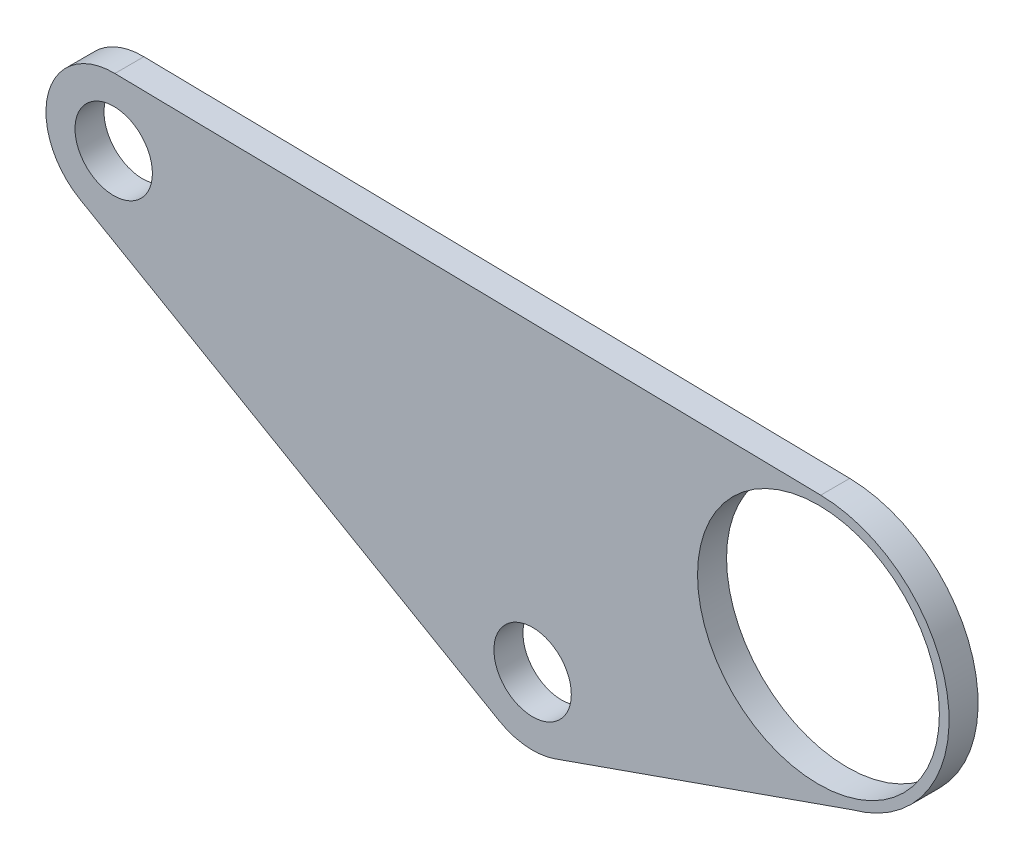
ISO-10303-21;
HEADER;
FILE_DESCRIPTION(('STEP AP214'),'2;1');
FILE_NAME('part.step','',(''),(''),'','','');
FILE_SCHEMA(('AUTOMOTIVE_DESIGN { 1 0 10303 214 1 1 1 1 }'));
ENDSEC;
DATA;
#1=APPLICATION_CONTEXT('core data for automotive mechanical design processes');
#2=APPLICATION_PROTOCOL_DEFINITION('international standard','automotive_design',2000,#1);
#3=PRODUCT_CONTEXT('',#1,'mechanical');
#4=PRODUCT('Part','Part','',(#3));
#5=PRODUCT_RELATED_PRODUCT_CATEGORY('part','',(#4));
#6=PRODUCT_DEFINITION_FORMATION('','',#4);
#7=PRODUCT_DEFINITION_CONTEXT('part definition',#1,'design');
#8=PRODUCT_DEFINITION('design','',#6,#7);
#9=PRODUCT_DEFINITION_SHAPE('','',#8);
#10=(LENGTH_UNIT() NAMED_UNIT(*) SI_UNIT(.MILLI.,.METRE.));
#11=(NAMED_UNIT(*) PLANE_ANGLE_UNIT() SI_UNIT($,.RADIAN.));
#12=(NAMED_UNIT(*) SI_UNIT($,.STERADIAN.) SOLID_ANGLE_UNIT());
#13=UNCERTAINTY_MEASURE_WITH_UNIT(LENGTH_MEASURE(1.E-05),#10,'distance_accuracy_value','');
#14=(GEOMETRIC_REPRESENTATION_CONTEXT(3) GLOBAL_UNCERTAINTY_ASSIGNED_CONTEXT((#13)) GLOBAL_UNIT_ASSIGNED_CONTEXT((#10,
#11,#12)) REPRESENTATION_CONTEXT('',''));
#15=CARTESIAN_POINT('',(0.,0.,0.));
#16=DIRECTION('',(0.,0.,1.));
#17=DIRECTION('',(1.,0.,0.));
#18=AXIS2_PLACEMENT_3D('',#15,#16,#17);
#19=CARTESIAN_POINT('',(83.5750083714108,-201.607395124083,640.));
#20=DIRECTION('',(0.,0.,1.));
#21=DIRECTION('',(1.,0.,0.));
#22=AXIS2_PLACEMENT_3D('',#19,#20,#21);
#23=CYLINDRICAL_SURFACE('',#22,6.99999999999999);
#24=CARTESIAN_POINT('',(83.5750083714108,-201.607395124083,643.));
#25=DIRECTION('',(0.,0.,1.));
#26=DIRECTION('',(1.,0.,0.));
#27=AXIS2_PLACEMENT_3D('',#24,#25,#26);
#28=CIRCLE('',#27,6.99999999999999);
#29=CARTESIAN_POINT('',(83.6965127444625,-194.608449725859,643.));
#30=VERTEX_POINT('',#29);
#31=CARTESIAN_POINT('',(80.0750083714108,-207.669572950574,643.));
#32=VERTEX_POINT('',#31);
#33=EDGE_CURVE('E126',#30,#32,#28,.T.);
#34=ORIENTED_EDGE('',*,*,#33,.F.);
#35=DIRECTION('',(0.,0.,1.));
#36=VECTOR('',#35,1.);
#37=CARTESIAN_POINT('',(83.6965127444625,-194.608449725859,640.));
#38=LINE('',#37,#36);
#39=CARTESIAN_POINT('',(83.6965127444625,-194.608449725859,640.));
#40=VERTEX_POINT('',#39);
#41=EDGE_CURVE('E11',#40,#30,#38,.T.);
#42=ORIENTED_EDGE('',*,*,#41,.F.);
#43=CARTESIAN_POINT('',(83.5750083714108,-201.607395124083,640.));
#44=DIRECTION('',(0.,0.,1.));
#45=DIRECTION('',(1.,0.,0.));
#46=AXIS2_PLACEMENT_3D('',#43,#44,#45);
#47=CIRCLE('',#46,6.99999999999999);
#48=CARTESIAN_POINT('',(80.0750083714108,-207.669572950574,640.));
#49=VERTEX_POINT('',#48);
#50=EDGE_CURVE('E141',#40,#49,#47,.T.);
#51=ORIENTED_EDGE('',*,*,#50,.T.);
#52=DIRECTION('',(0.,0.,1.));
#53=VECTOR('',#52,1.);
#54=CARTESIAN_POINT('',(80.0750083714108,-207.669572950574,640.));
#55=LINE('',#54,#53);
#56=EDGE_CURVE('E44',#49,#32,#55,.T.);
#57=ORIENTED_EDGE('',*,*,#56,.T.);
#58=EDGE_LOOP('',(#34,#42,#51,#57));
#59=FACE_BOUND('',#58,.T.);
#60=ADVANCED_FACE('F41',(#59),#23,.T.);
#61=CARTESIAN_POINT('',(83.6965127444625,-194.608449725859,640.));
#62=DIRECTION('',(0.0173577675788195,0.999849342603514,0.));
#63=DIRECTION('',(-0.999849342603514,0.0173577675788195,0.));
#64=AXIS2_PLACEMENT_3D('',#61,#62,#63);
#65=PLANE('',#64);
#66=DIRECTION('',(-0.999849342603514,0.0173577675788195,0.));
#67=VECTOR('',#66,1.);
#68=CARTESIAN_POINT('',(83.6965127444625,-194.608449725859,643.));
#69=LINE('',#68,#67);
#70=CARTESIAN_POINT('',(156.656789284563,-195.875068073951,643.));
#71=VERTEX_POINT('',#70);
#72=EDGE_CURVE('E139',#71,#30,#69,.T.);
#73=ORIENTED_EDGE('',*,*,#72,.F.);
#74=DIRECTION('',(0.,0.,1.));
#75=VECTOR('',#74,1.);
#76=CARTESIAN_POINT('',(156.656789284563,-195.875068073951,640.));
#77=LINE('',#76,#75);
#78=CARTESIAN_POINT('',(156.656789284563,-195.875068073951,640.));
#79=VERTEX_POINT('',#78);
#80=EDGE_CURVE('E50',#79,#71,#77,.T.);
#81=ORIENTED_EDGE('',*,*,#80,.F.);
#82=DIRECTION('',(-0.999849342603514,0.0173577675788195,0.));
#83=VECTOR('',#82,1.);
#84=CARTESIAN_POINT('',(83.6965127444625,-194.608449725859,640.));
#85=LINE('',#84,#83);
#86=EDGE_CURVE('E116',#79,#40,#85,.T.);
#87=ORIENTED_EDGE('',*,*,#86,.T.);
#88=ORIENTED_EDGE('',*,*,#41,.T.);
#89=EDGE_LOOP('',(#73,#81,#87,#88));
#90=FACE_BOUND('',#89,.T.);
#91=ADVANCED_FACE('F149',(#90),#65,.T.);
#92=CARTESIAN_POINT('',(156.422459422249,-209.373034199098,640.));
#93=DIRECTION('',(0.,0.,1.));
#94=DIRECTION('',(1.,0.,0.));
#95=AXIS2_PLACEMENT_3D('',#92,#93,#94);
#96=CYLINDRICAL_SURFACE('',#95,13.5);
#97=CARTESIAN_POINT('',(156.422459422249,-209.373034199098,643.));
#98=DIRECTION('',(0.,0.,1.));
#99=DIRECTION('',(1.,0.,0.));
#100=AXIS2_PLACEMENT_3D('',#97,#98,#99);
#101=CIRCLE('',#100,13.5);
#102=CARTESIAN_POINT('',(159.916516531133,-222.413032854001,643.));
#103=VERTEX_POINT('',#102);
#104=EDGE_CURVE('E103',#103,#71,#101,.T.);
#105=ORIENTED_EDGE('',*,*,#104,.F.);
#106=DIRECTION('',(0.,0.,1.));
#107=VECTOR('',#106,1.);
#108=CARTESIAN_POINT('',(159.916516531133,-222.413032854001,640.));
#109=LINE('',#108,#107);
#110=CARTESIAN_POINT('',(159.916516531133,-222.413032854001,640.));
#111=VERTEX_POINT('',#110);
#112=EDGE_CURVE('E98',#111,#103,#109,.T.);
#113=ORIENTED_EDGE('',*,*,#112,.F.);
#114=CARTESIAN_POINT('',(156.422459422249,-209.373034199098,640.));
#115=DIRECTION('',(0.,0.,1.));
#116=DIRECTION('',(1.,0.,0.));
#117=AXIS2_PLACEMENT_3D('',#114,#115,#116);
#118=CIRCLE('',#117,13.5);
#119=EDGE_CURVE('E101',#111,#79,#118,.T.);
#120=ORIENTED_EDGE('',*,*,#119,.T.);
#121=ORIENTED_EDGE('',*,*,#80,.T.);
#122=EDGE_LOOP('',(#105,#113,#120,#121));
#123=FACE_BOUND('',#122,.T.);
#124=ADVANCED_FACE('F100',(#123),#96,.T.);
#125=CARTESIAN_POINT('',(129.197661631948,-233.211271306766,640.));
#126=DIRECTION('',(0.331626153045014,-0.943410883240471,0.));
#127=DIRECTION('',(0.943410883240471,0.331626153045014,0.));
#128=AXIS2_PLACEMENT_3D('',#125,#126,#127);
#129=PLANE('',#128);
#130=DIRECTION('',(0.943410883240471,0.331626153045014,0.));
#131=VECTOR('',#130,1.);
#132=CARTESIAN_POINT('',(129.197661631948,-233.211271306766,643.));
#133=LINE('',#132,#131);
#134=CARTESIAN_POINT('',(129.197661631948,-233.211271306766,643.));
#135=VERTEX_POINT('',#134);
#136=EDGE_CURVE('E136',#135,#103,#133,.T.);
#137=ORIENTED_EDGE('',*,*,#136,.F.);
#138=DIRECTION('',(0.,0.,1.));
#139=VECTOR('',#138,1.);
#140=CARTESIAN_POINT('',(129.197661631948,-233.211271306766,640.));
#141=LINE('',#140,#139);
#142=CARTESIAN_POINT('',(129.197661631948,-233.211271306766,640.));
#143=VERTEX_POINT('',#142);
#144=EDGE_CURVE('E108',#143,#135,#141,.T.);
#145=ORIENTED_EDGE('',*,*,#144,.F.);
#146=DIRECTION('',(0.943410883240471,0.331626153045014,0.));
#147=VECTOR('',#146,1.);
#148=CARTESIAN_POINT('',(129.197661631948,-233.211271306766,640.));
#149=LINE('',#148,#147);
#150=EDGE_CURVE('E114',#143,#111,#149,.T.);
#151=ORIENTED_EDGE('',*,*,#150,.T.);
#152=ORIENTED_EDGE('',*,*,#112,.T.);
#153=EDGE_LOOP('',(#137,#145,#151,#152));
#154=FACE_BOUND('',#153,.T.);
#155=ADVANCED_FACE('F118',(#154),#129,.T.);
#156=CARTESIAN_POINT('',(126.876278560633,-226.607395124083,640.));
#157=DIRECTION('',(0.,0.,1.));
#158=DIRECTION('',(1.,0.,0.));
#159=AXIS2_PLACEMENT_3D('',#156,#157,#158);
#160=CYLINDRICAL_SURFACE('',#159,6.99999999999999);
#161=CARTESIAN_POINT('',(126.876278560633,-226.607395124083,643.));
#162=DIRECTION('',(0.,0.,1.));
#163=DIRECTION('',(1.,0.,0.));
#164=AXIS2_PLACEMENT_3D('',#161,#162,#163);
#165=CIRCLE('',#164,6.99999999999999);
#166=CARTESIAN_POINT('',(123.376278560633,-232.669572950574,643.));
#167=VERTEX_POINT('',#166);
#168=EDGE_CURVE('E133',#167,#135,#165,.T.);
#169=ORIENTED_EDGE('',*,*,#168,.F.);
#170=DIRECTION('',(0.,0.,1.));
#171=VECTOR('',#170,1.);
#172=CARTESIAN_POINT('',(123.376278560633,-232.669572950574,640.));
#173=LINE('',#172,#171);
#174=CARTESIAN_POINT('',(123.376278560633,-232.669572950574,640.));
#175=VERTEX_POINT('',#174);
#176=EDGE_CURVE('E144',#175,#167,#173,.T.);
#177=ORIENTED_EDGE('',*,*,#176,.F.);
#178=CARTESIAN_POINT('',(126.876278560633,-226.607395124083,640.));
#179=DIRECTION('',(0.,0.,1.));
#180=DIRECTION('',(1.,0.,0.));
#181=AXIS2_PLACEMENT_3D('',#178,#179,#180);
#182=CIRCLE('',#181,6.99999999999999);
#183=EDGE_CURVE('E119',#175,#143,#182,.T.);
#184=ORIENTED_EDGE('',*,*,#183,.T.);
#185=ORIENTED_EDGE('',*,*,#144,.T.);
#186=EDGE_LOOP('',(#169,#177,#184,#185));
#187=FACE_BOUND('',#186,.T.);
#188=ADVANCED_FACE('F163',(#187),#160,.T.);
#189=CARTESIAN_POINT('',(80.0750083714108,-207.669572950574,640.));
#190=DIRECTION('',(-0.499999999999996,-0.866025403784441,0.));
#191=DIRECTION('',(0.866025403784441,-0.499999999999996,0.));
#192=AXIS2_PLACEMENT_3D('',#189,#190,#191);
#193=PLANE('',#192);
#194=DIRECTION('',(0.866025403784441,-0.499999999999996,0.));
#195=VECTOR('',#194,1.);
#196=CARTESIAN_POINT('',(80.0750083714108,-207.669572950574,643.));
#197=LINE('',#196,#195);
#198=EDGE_CURVE('E129',#32,#167,#197,.T.);
#199=ORIENTED_EDGE('',*,*,#198,.F.);
#200=ORIENTED_EDGE('',*,*,#56,.F.);
#201=DIRECTION('',(0.866025403784441,-0.499999999999996,0.));
#202=VECTOR('',#201,1.);
#203=CARTESIAN_POINT('',(80.0750083714108,-207.669572950574,640.));
#204=LINE('',#203,#202);
#205=EDGE_CURVE('E121',#49,#175,#204,.T.);
#206=ORIENTED_EDGE('',*,*,#205,.T.);
#207=ORIENTED_EDGE('',*,*,#176,.T.);
#208=EDGE_LOOP('',(#199,#200,#206,#207));
#209=FACE_BOUND('',#208,.T.);
#210=ADVANCED_FACE('F146',(#209),#193,.T.);
#211=CARTESIAN_POINT('',(83.5750083714108,-201.607395124083,640.));
#212=DIRECTION('',(0.,0.,1.));
#213=DIRECTION('',(1.,0.,0.));
#214=AXIS2_PLACEMENT_3D('',#211,#212,#213);
#215=PLANE('',#214);
#216=CARTESIAN_POINT('',(156.422459422249,-209.373034199098,640.));
#217=DIRECTION('',(0.,0.,1.));
#218=DIRECTION('',(1.,0.,0.));
#219=AXIS2_PLACEMENT_3D('',#216,#217,#218);
#220=CIRCLE('',#219,12.5);
#221=CARTESIAN_POINT('',(168.922459422249,-209.373034199098,640.));
#222=VERTEX_POINT('',#221);
#223=EDGE_CURVE('E196',#222,#222,#220,.T.);
#224=ORIENTED_EDGE('',*,*,#223,.T.);
#225=EDGE_LOOP('',(#224));
#226=FACE_BOUND('',#225,.T.);
#227=CARTESIAN_POINT('',(126.876278560633,-226.607395124083,640.));
#228=DIRECTION('',(0.,0.,1.));
#229=DIRECTION('',(1.,0.,0.));
#230=AXIS2_PLACEMENT_3D('',#227,#228,#229);
#231=CIRCLE('',#230,3.99999999999997);
#232=CARTESIAN_POINT('',(130.876278560633,-226.607395124083,640.));
#233=VERTEX_POINT('',#232);
#234=EDGE_CURVE('E204',#233,#233,#231,.T.);
#235=ORIENTED_EDGE('',*,*,#234,.T.);
#236=EDGE_LOOP('',(#235));
#237=FACE_BOUND('',#236,.T.);
#238=CARTESIAN_POINT('',(83.5750083714108,-201.607395124083,640.));
#239=DIRECTION('',(0.,0.,1.));
#240=DIRECTION('',(1.,0.,0.));
#241=AXIS2_PLACEMENT_3D('',#238,#239,#240);
#242=CIRCLE('',#241,4.00000000000001);
#243=CARTESIAN_POINT('',(87.5750083714108,-201.607395124083,640.));
#244=VERTEX_POINT('',#243);
#245=EDGE_CURVE('E130',#244,#244,#242,.T.);
#246=ORIENTED_EDGE('',*,*,#245,.T.);
#247=EDGE_LOOP('',(#246));
#248=FACE_BOUND('',#247,.T.);
#249=ORIENTED_EDGE('',*,*,#50,.F.);
#250=ORIENTED_EDGE('',*,*,#86,.F.);
#251=ORIENTED_EDGE('',*,*,#119,.F.);
#252=ORIENTED_EDGE('',*,*,#150,.F.);
#253=ORIENTED_EDGE('',*,*,#183,.F.);
#254=ORIENTED_EDGE('',*,*,#205,.F.);
#255=EDGE_LOOP('',(#249,#250,#251,#252,#253,#254));
#256=FACE_BOUND('',#255,.T.);
#257=ADVANCED_FACE('F112',(#226,#237,#248,#256),#215,.F.);
#258=CARTESIAN_POINT('',(83.5750083714108,-201.607395124083,643.));
#259=DIRECTION('',(0.,0.,1.));
#260=DIRECTION('',(1.,0.,0.));
#261=AXIS2_PLACEMENT_3D('',#258,#259,#260);
#262=PLANE('',#261);
#263=CARTESIAN_POINT('',(156.422459422249,-209.373034199098,643.));
#264=DIRECTION('',(0.,0.,1.));
#265=DIRECTION('',(1.,0.,0.));
#266=AXIS2_PLACEMENT_3D('',#263,#264,#265);
#267=CIRCLE('',#266,12.5);
#268=CARTESIAN_POINT('',(168.922459422249,-209.373034199098,643.));
#269=VERTEX_POINT('',#268);
#270=EDGE_CURVE('E199',#269,#269,#267,.T.);
#271=ORIENTED_EDGE('',*,*,#270,.F.);
#272=EDGE_LOOP('',(#271));
#273=FACE_BOUND('',#272,.T.);
#274=CARTESIAN_POINT('',(126.876278560633,-226.607395124083,643.));
#275=DIRECTION('',(0.,0.,1.));
#276=DIRECTION('',(1.,0.,0.));
#277=AXIS2_PLACEMENT_3D('',#274,#275,#276);
#278=CIRCLE('',#277,3.99999999999997);
#279=CARTESIAN_POINT('',(130.876278560633,-226.607395124083,643.));
#280=VERTEX_POINT('',#279);
#281=EDGE_CURVE('E201',#280,#280,#278,.T.);
#282=ORIENTED_EDGE('',*,*,#281,.F.);
#283=EDGE_LOOP('',(#282));
#284=FACE_BOUND('',#283,.T.);
#285=CARTESIAN_POINT('',(83.5750083714108,-201.607395124083,643.));
#286=DIRECTION('',(0.,0.,1.));
#287=DIRECTION('',(1.,0.,0.));
#288=AXIS2_PLACEMENT_3D('',#285,#286,#287);
#289=CIRCLE('',#288,4.00000000000001);
#290=CARTESIAN_POINT('',(87.5750083714108,-201.607395124083,643.));
#291=VERTEX_POINT('',#290);
#292=EDGE_CURVE('E207',#291,#291,#289,.T.);
#293=ORIENTED_EDGE('',*,*,#292,.F.);
#294=EDGE_LOOP('',(#293));
#295=FACE_BOUND('',#294,.T.);
#296=ORIENTED_EDGE('',*,*,#33,.T.);
#297=ORIENTED_EDGE('',*,*,#198,.T.);
#298=ORIENTED_EDGE('',*,*,#168,.T.);
#299=ORIENTED_EDGE('',*,*,#136,.T.);
#300=ORIENTED_EDGE('',*,*,#104,.T.);
#301=ORIENTED_EDGE('',*,*,#72,.T.);
#302=EDGE_LOOP('',(#296,#297,#298,#299,#300,#301));
#303=FACE_BOUND('',#302,.T.);
#304=ADVANCED_FACE('F148',(#273,#284,#295,#303),#262,.T.);
#305=CARTESIAN_POINT('',(83.5750083714108,-201.607395124083,640.));
#306=DIRECTION('',(0.,0.,1.));
#307=DIRECTION('',(1.,0.,0.));
#308=AXIS2_PLACEMENT_3D('',#305,#306,#307);
#309=CYLINDRICAL_SURFACE('',#308,4.00000000000001);
#310=ORIENTED_EDGE('',*,*,#245,.F.);
#311=EDGE_LOOP('',(#310));
#312=FACE_BOUND('',#311,.T.);
#313=ORIENTED_EDGE('',*,*,#292,.T.);
#314=EDGE_LOOP('',(#313));
#315=FACE_BOUND('',#314,.T.);
#316=ADVANCED_FACE('F176',(#312,#315),#309,.F.);
#317=CARTESIAN_POINT('',(126.876278560633,-226.607395124083,640.));
#318=DIRECTION('',(0.,0.,1.));
#319=DIRECTION('',(1.,0.,0.));
#320=AXIS2_PLACEMENT_3D('',#317,#318,#319);
#321=CYLINDRICAL_SURFACE('',#320,3.99999999999997);
#322=ORIENTED_EDGE('',*,*,#234,.F.);
#323=EDGE_LOOP('',(#322));
#324=FACE_BOUND('',#323,.T.);
#325=ORIENTED_EDGE('',*,*,#281,.T.);
#326=EDGE_LOOP('',(#325));
#327=FACE_BOUND('',#326,.T.);
#328=ADVANCED_FACE('F183',(#324,#327),#321,.F.);
#329=CARTESIAN_POINT('',(156.422459422249,-209.373034199098,640.));
#330=DIRECTION('',(0.,0.,1.));
#331=DIRECTION('',(1.,0.,0.));
#332=AXIS2_PLACEMENT_3D('',#329,#330,#331);
#333=CYLINDRICAL_SURFACE('',#332,12.5);
#334=ORIENTED_EDGE('',*,*,#223,.F.);
#335=EDGE_LOOP('',(#334));
#336=FACE_BOUND('',#335,.T.);
#337=ORIENTED_EDGE('',*,*,#270,.T.);
#338=EDGE_LOOP('',(#337));
#339=FACE_BOUND('',#338,.T.);
#340=ADVANCED_FACE('F187',(#336,#339),#333,.F.);
#341=CLOSED_SHELL('',(#60,#91,#124,#155,#188,#210,#257,#304,#316,#328,#340));
#342=MANIFOLD_SOLID_BREP('B2',#341);
#343=ADVANCED_BREP_SHAPE_REPRESENTATION('',(#18,#342),#14);
#344=SHAPE_DEFINITION_REPRESENTATION(#9,#343);
ENDSEC;
END-ISO-10303-21;
